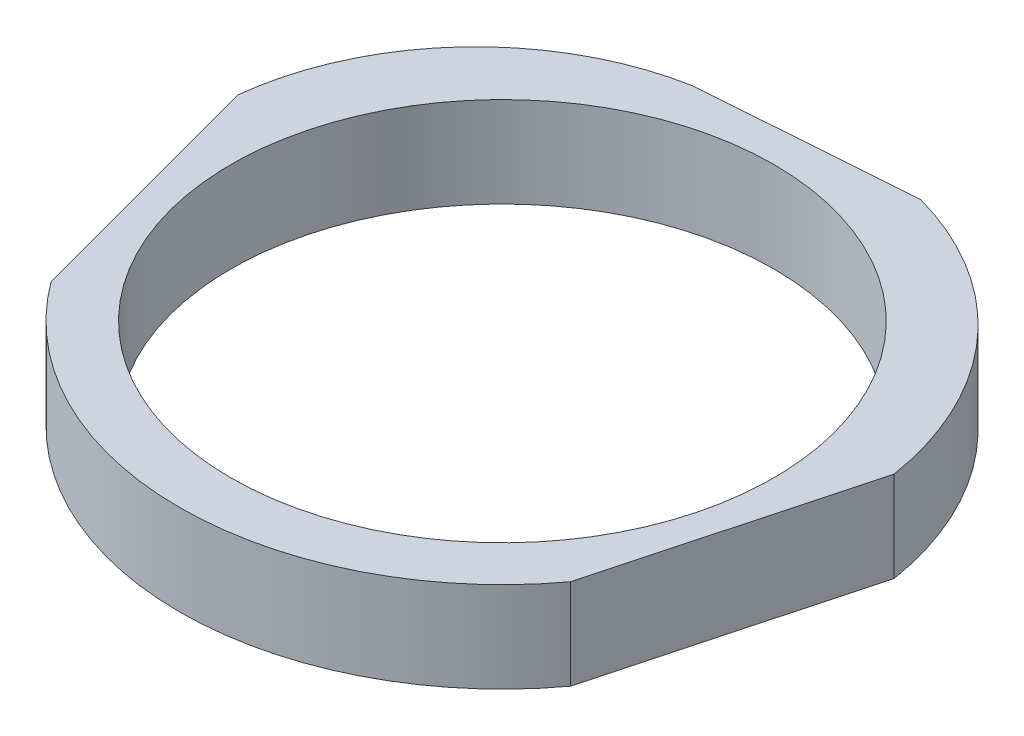
ISO-10303-21;
HEADER;
FILE_DESCRIPTION(('STEP AP214'),'2;1');
FILE_NAME('part.step','',(''),(''),'','','');
FILE_SCHEMA(('AUTOMOTIVE_DESIGN { 1 0 10303 214 1 1 1 1 }'));
ENDSEC;
DATA;
#1=APPLICATION_CONTEXT('core data for automotive mechanical design processes');
#2=APPLICATION_PROTOCOL_DEFINITION('international standard','automotive_design',2000,#1);
#3=PRODUCT_CONTEXT('',#1,'mechanical');
#4=PRODUCT('Part','Part','',(#3));
#5=PRODUCT_RELATED_PRODUCT_CATEGORY('part','',(#4));
#6=PRODUCT_DEFINITION_FORMATION('','',#4);
#7=PRODUCT_DEFINITION_CONTEXT('part definition',#1,'design');
#8=PRODUCT_DEFINITION('design','',#6,#7);
#9=PRODUCT_DEFINITION_SHAPE('','',#8);
#10=(LENGTH_UNIT() NAMED_UNIT(*) SI_UNIT(.MILLI.,.METRE.));
#11=(NAMED_UNIT(*) PLANE_ANGLE_UNIT() SI_UNIT($,.RADIAN.));
#12=(NAMED_UNIT(*) SI_UNIT($,.STERADIAN.) SOLID_ANGLE_UNIT());
#13=UNCERTAINTY_MEASURE_WITH_UNIT(LENGTH_MEASURE(1.E-05),#10,'distance_accuracy_value','');
#14=(GEOMETRIC_REPRESENTATION_CONTEXT(3) GLOBAL_UNCERTAINTY_ASSIGNED_CONTEXT((#13)) GLOBAL_UNIT_ASSIGNED_CONTEXT((#10,
#11,#12)) REPRESENTATION_CONTEXT('',''));
#15=CARTESIAN_POINT('',(0.,0.,0.));
#16=DIRECTION('',(0.,0.,1.));
#17=DIRECTION('',(1.,0.,0.));
#18=AXIS2_PLACEMENT_3D('',#15,#16,#17);
#19=CARTESIAN_POINT('',(0.,1.5,0.));
#20=DIRECTION('',(0.,-1.,0.));
#21=DIRECTION('',(0.,0.,-1.));
#22=AXIS2_PLACEMENT_3D('',#19,#20,#21);
#23=PLANE('',#22);
#24=CARTESIAN_POINT('',(0.,1.5,0.));
#25=DIRECTION('',(0.,1.,0.));
#26=DIRECTION('',(0.,0.,-1.));
#27=AXIS2_PLACEMENT_3D('',#24,#25,#26);
#28=CIRCLE('',#27,10.7009889381388);
#29=CARTESIAN_POINT('',(-8.61328417354084,1.5,6.35));
#30=VERTEX_POINT('',#29);
#31=CARTESIAN_POINT('',(8.61328417354084,1.5,6.35));
#32=VERTEX_POINT('',#31);
#33=EDGE_CURVE('E129',#30,#32,#28,.T.);
#34=ORIENTED_EDGE('',*,*,#33,.T.);
#35=DIRECTION('',(0.259311122223769,0.,-0.965793840263568));
#36=VECTOR('',#35,1.);
#37=CARTESIAN_POINT('',(8.61328417354084,1.5,6.35));
#38=LINE('',#37,#36);
#39=CARTESIAN_POINT('',(10.8834106281456,1.5,-2.10499463221916));
#40=VERTEX_POINT('',#39);
#41=EDGE_CURVE('E87',#32,#40,#38,.T.);
#42=ORIENTED_EDGE('',*,*,#41,.T.);
#43=CARTESIAN_POINT('',(0.71454837013126,1.5,-0.499901874327204));
#44=DIRECTION('',(0.,1.,0.));
#45=DIRECTION('',(0.,0.,-1.));
#46=AXIS2_PLACEMENT_3D('',#43,#44,#45);
#47=CIRCLE('',#46,10.2947599478524);
#48=CARTESIAN_POINT('',(3.44313637443088,1.5,-10.4264768066339));
#49=VERTEX_POINT('',#48);
#50=EDGE_CURVE('E100',#40,#49,#47,.T.);
#51=ORIENTED_EDGE('',*,*,#50,.T.);
#52=DIRECTION('',(-0.9973580207554,0.,0.0726428140621759));
#53=VECTOR('',#52,1.);
#54=CARTESIAN_POINT('',(-3.59094498208684,1.5,-9.91414777989908));
#55=LINE('',#54,#53);
#56=CARTESIAN_POINT('',(-3.59094498208684,1.5,-9.91414777989908));
#57=VERTEX_POINT('',#56);
#58=EDGE_CURVE('E94',#49,#57,#55,.T.);
#59=ORIENTED_EDGE('',*,*,#58,.T.);
#60=CARTESIAN_POINT('',(-2.00248523666896,1.5,-1.12122864174121));
#61=DIRECTION('',(0.,1.,0.));
#62=DIRECTION('',(0.,0.,-1.));
#63=AXIS2_PLACEMENT_3D('',#60,#61,#62);
#64=CIRCLE('',#63,8.93524657370998);
#65=CARTESIAN_POINT('',(-10.8834106281456,1.5,-2.10499463221916));
#66=VERTEX_POINT('',#65);
#67=EDGE_CURVE('E98',#57,#66,#64,.T.);
#68=ORIENTED_EDGE('',*,*,#67,.T.);
#69=DIRECTION('',(0.259311122223767,0.,0.965793840263568));
#70=VECTOR('',#69,1.);
#71=CARTESIAN_POINT('',(-8.61328417354084,1.5,6.35));
#72=LINE('',#71,#70);
#73=EDGE_CURVE('E50',#66,#30,#72,.T.);
#74=ORIENTED_EDGE('',*,*,#73,.T.);
#75=EDGE_LOOP('',(#34,#42,#51,#59,#68,#74));
#76=FACE_BOUND('',#75,.T.);
#77=CARTESIAN_POINT('',(0.,1.5,0.));
#78=DIRECTION('',(0.,1.,0.));
#79=DIRECTION('',(0.,0.,1.));
#80=AXIS2_PLACEMENT_3D('',#77,#78,#79);
#81=CIRCLE('',#80,9.);
#82=CARTESIAN_POINT('',(0.,1.5,9.));
#83=VERTEX_POINT('',#82);
#84=EDGE_CURVE('E122',#83,#83,#81,.T.);
#85=ORIENTED_EDGE('',*,*,#84,.F.);
#86=EDGE_LOOP('',(#85));
#87=FACE_BOUND('',#86,.T.);
#88=ADVANCED_FACE('F33',(#76,#87),#23,.F.);
#89=CARTESIAN_POINT('',(0.,-1.5,0.));
#90=DIRECTION('',(0.,-1.,0.));
#91=DIRECTION('',(0.,0.,-1.));
#92=AXIS2_PLACEMENT_3D('',#89,#90,#91);
#93=PLANE('',#92);
#94=CARTESIAN_POINT('',(0.,-1.5,0.));
#95=DIRECTION('',(0.,1.,0.));
#96=DIRECTION('',(0.,0.,-1.));
#97=AXIS2_PLACEMENT_3D('',#94,#95,#96);
#98=CIRCLE('',#97,10.7009889381388);
#99=CARTESIAN_POINT('',(-8.61328417354084,-1.5,6.35));
#100=VERTEX_POINT('',#99);
#101=CARTESIAN_POINT('',(8.61328417354084,-1.5,6.35));
#102=VERTEX_POINT('',#101);
#103=EDGE_CURVE('E118',#100,#102,#98,.T.);
#104=ORIENTED_EDGE('',*,*,#103,.F.);
#105=DIRECTION('',(0.259311122223767,0.,0.965793840263568));
#106=VECTOR('',#105,1.);
#107=CARTESIAN_POINT('',(-8.61328417354084,-1.5,6.35));
#108=LINE('',#107,#106);
#109=CARTESIAN_POINT('',(-10.8834106281456,-1.5,-2.10499463221916));
#110=VERTEX_POINT('',#109);
#111=EDGE_CURVE('E79',#110,#100,#108,.T.);
#112=ORIENTED_EDGE('',*,*,#111,.F.);
#113=CARTESIAN_POINT('',(-2.00248523666896,-1.5,-1.12122864174121));
#114=DIRECTION('',(0.,1.,0.));
#115=DIRECTION('',(0.,0.,-1.));
#116=AXIS2_PLACEMENT_3D('',#113,#114,#115);
#117=CIRCLE('',#116,8.93524657370998);
#118=CARTESIAN_POINT('',(-3.59094498208684,-1.5,-9.91414777989908));
#119=VERTEX_POINT('',#118);
#120=EDGE_CURVE('E73',#119,#110,#117,.T.);
#121=ORIENTED_EDGE('',*,*,#120,.F.);
#122=DIRECTION('',(-0.9973580207554,0.,0.0726428140621759));
#123=VECTOR('',#122,1.);
#124=CARTESIAN_POINT('',(-3.59094498208684,-1.5,-9.91414777989908));
#125=LINE('',#124,#123);
#126=CARTESIAN_POINT('',(3.44313637443088,-1.5,-10.4264768066339));
#127=VERTEX_POINT('',#126);
#128=EDGE_CURVE('E108',#127,#119,#125,.T.);
#129=ORIENTED_EDGE('',*,*,#128,.F.);
#130=CARTESIAN_POINT('',(0.71454837013126,-1.5,-0.499901874327204));
#131=DIRECTION('',(0.,1.,0.));
#132=DIRECTION('',(0.,0.,-1.));
#133=AXIS2_PLACEMENT_3D('',#130,#131,#132);
#134=CIRCLE('',#133,10.2947599478524);
#135=CARTESIAN_POINT('',(10.8834106281456,-1.5,-2.10499463221916));
#136=VERTEX_POINT('',#135);
#137=EDGE_CURVE('E124',#136,#127,#134,.T.);
#138=ORIENTED_EDGE('',*,*,#137,.F.);
#139=DIRECTION('',(0.259311122223769,0.,-0.965793840263568));
#140=VECTOR('',#139,1.);
#141=CARTESIAN_POINT('',(8.61328417354084,-1.5,6.35));
#142=LINE('',#141,#140);
#143=EDGE_CURVE('E121',#102,#136,#142,.T.);
#144=ORIENTED_EDGE('',*,*,#143,.F.);
#145=EDGE_LOOP('',(#104,#112,#121,#129,#138,#144));
#146=FACE_BOUND('',#145,.T.);
#147=CARTESIAN_POINT('',(0.,-1.5,0.));
#148=DIRECTION('',(0.,1.,0.));
#149=DIRECTION('',(0.,0.,1.));
#150=AXIS2_PLACEMENT_3D('',#147,#148,#149);
#151=CIRCLE('',#150,9.);
#152=CARTESIAN_POINT('',(0.,-1.5,9.));
#153=VERTEX_POINT('',#152);
#154=EDGE_CURVE('E222',#153,#153,#151,.T.);
#155=ORIENTED_EDGE('',*,*,#154,.T.);
#156=EDGE_LOOP('',(#155));
#157=FACE_BOUND('',#156,.T.);
#158=ADVANCED_FACE('F138',(#146,#157),#93,.T.);
#159=CARTESIAN_POINT('',(0.,1.5,0.));
#160=DIRECTION('',(0.,-1.,0.));
#161=DIRECTION('',(0.,0.,-1.));
#162=AXIS2_PLACEMENT_3D('',#159,#160,#161);
#163=CYLINDRICAL_SURFACE('',#162,10.7009889381388);
#164=ORIENTED_EDGE('',*,*,#103,.T.);
#165=DIRECTION('',(0.,-1.,0.));
#166=VECTOR('',#165,1.);
#167=CARTESIAN_POINT('',(8.61328417354084,1.5,6.35));
#168=LINE('',#167,#166);
#169=EDGE_CURVE('E11',#32,#102,#168,.T.);
#170=ORIENTED_EDGE('',*,*,#169,.F.);
#171=ORIENTED_EDGE('',*,*,#33,.F.);
#172=DIRECTION('',(0.,-1.,0.));
#173=VECTOR('',#172,1.);
#174=CARTESIAN_POINT('',(-8.61328417354084,1.5,6.35));
#175=LINE('',#174,#173);
#176=EDGE_CURVE('E114',#30,#100,#175,.T.);
#177=ORIENTED_EDGE('',*,*,#176,.T.);
#178=EDGE_LOOP('',(#164,#170,#171,#177));
#179=FACE_BOUND('',#178,.T.);
#180=ADVANCED_FACE('F35',(#179),#163,.T.);
#181=CARTESIAN_POINT('',(8.61328417354084,1.5,6.35));
#182=DIRECTION('',(-0.965793840263568,0.,-0.259311122223769));
#183=DIRECTION('',(-0.259311122223769,0.,0.965793840263568));
#184=AXIS2_PLACEMENT_3D('',#181,#182,#183);
#185=PLANE('',#184);
#186=ORIENTED_EDGE('',*,*,#143,.T.);
#187=DIRECTION('',(0.,-1.,0.));
#188=VECTOR('',#187,1.);
#189=CARTESIAN_POINT('',(10.8834106281456,1.5,-2.10499463221916));
#190=LINE('',#189,#188);
#191=EDGE_CURVE('E42',#40,#136,#190,.T.);
#192=ORIENTED_EDGE('',*,*,#191,.F.);
#193=ORIENTED_EDGE('',*,*,#41,.F.);
#194=ORIENTED_EDGE('',*,*,#169,.T.);
#195=EDGE_LOOP('',(#186,#192,#193,#194));
#196=FACE_BOUND('',#195,.T.);
#197=ADVANCED_FACE('F163',(#196),#185,.F.);
#198=CARTESIAN_POINT('',(0.71454837013126,1.5,-0.499901874327204));
#199=DIRECTION('',(0.,-1.,0.));
#200=DIRECTION('',(0.,0.,-1.));
#201=AXIS2_PLACEMENT_3D('',#198,#199,#200);
#202=CYLINDRICAL_SURFACE('',#201,10.2947599478524);
#203=ORIENTED_EDGE('',*,*,#137,.T.);
#204=DIRECTION('',(0.,-1.,0.));
#205=VECTOR('',#204,1.);
#206=CARTESIAN_POINT('',(3.44313637443088,1.5,-10.4264768066339));
#207=LINE('',#206,#205);
#208=EDGE_CURVE('E109',#49,#127,#207,.T.);
#209=ORIENTED_EDGE('',*,*,#208,.F.);
#210=ORIENTED_EDGE('',*,*,#50,.F.);
#211=ORIENTED_EDGE('',*,*,#191,.T.);
#212=EDGE_LOOP('',(#203,#209,#210,#211));
#213=FACE_BOUND('',#212,.T.);
#214=ADVANCED_FACE('F135',(#213),#202,.T.);
#215=CARTESIAN_POINT('',(-3.59094498208684,1.5,-9.91414777989908));
#216=DIRECTION('',(0.0726428140621759,0.,0.9973580207554));
#217=DIRECTION('',(0.9973580207554,0.,-0.0726428140621759));
#218=AXIS2_PLACEMENT_3D('',#215,#216,#217);
#219=PLANE('',#218);
#220=ORIENTED_EDGE('',*,*,#128,.T.);
#221=DIRECTION('',(0.,-1.,0.));
#222=VECTOR('',#221,1.);
#223=CARTESIAN_POINT('',(-3.59094498208684,1.5,-9.91414777989908));
#224=LINE('',#223,#222);
#225=EDGE_CURVE('E105',#57,#119,#224,.T.);
#226=ORIENTED_EDGE('',*,*,#225,.F.);
#227=ORIENTED_EDGE('',*,*,#58,.F.);
#228=ORIENTED_EDGE('',*,*,#208,.T.);
#229=EDGE_LOOP('',(#220,#226,#227,#228));
#230=FACE_BOUND('',#229,.T.);
#231=ADVANCED_FACE('F106',(#230),#219,.F.);
#232=CARTESIAN_POINT('',(-2.00248523666896,1.5,-1.12122864174121));
#233=DIRECTION('',(0.,-1.,0.));
#234=DIRECTION('',(0.,0.,-1.));
#235=AXIS2_PLACEMENT_3D('',#232,#233,#234);
#236=CYLINDRICAL_SURFACE('',#235,8.93524657370998);
#237=ORIENTED_EDGE('',*,*,#120,.T.);
#238=DIRECTION('',(0.,-1.,0.));
#239=VECTOR('',#238,1.);
#240=CARTESIAN_POINT('',(-10.8834106281456,1.5,-2.10499463221916));
#241=LINE('',#240,#239);
#242=EDGE_CURVE('E110',#66,#110,#241,.T.);
#243=ORIENTED_EDGE('',*,*,#242,.F.);
#244=ORIENTED_EDGE('',*,*,#67,.F.);
#245=ORIENTED_EDGE('',*,*,#225,.T.);
#246=EDGE_LOOP('',(#237,#243,#244,#245));
#247=FACE_BOUND('',#246,.T.);
#248=ADVANCED_FACE('F112',(#247),#236,.T.);
#249=CARTESIAN_POINT('',(-8.61328417354084,1.5,6.35));
#250=DIRECTION('',(0.965793840263568,0.,-0.259311122223767));
#251=DIRECTION('',(-0.259311122223767,0.,-0.965793840263568));
#252=AXIS2_PLACEMENT_3D('',#249,#250,#251);
#253=PLANE('',#252);
#254=ORIENTED_EDGE('',*,*,#111,.T.);
#255=ORIENTED_EDGE('',*,*,#176,.F.);
#256=ORIENTED_EDGE('',*,*,#73,.F.);
#257=ORIENTED_EDGE('',*,*,#242,.T.);
#258=EDGE_LOOP('',(#254,#255,#256,#257));
#259=FACE_BOUND('',#258,.T.);
#260=ADVANCED_FACE('F143',(#259),#253,.F.);
#261=CARTESIAN_POINT('',(0.,1.5,0.));
#262=DIRECTION('',(0.,-1.,0.));
#263=DIRECTION('',(0.,0.,-1.));
#264=AXIS2_PLACEMENT_3D('',#261,#262,#263);
#265=CYLINDRICAL_SURFACE('',#264,9.);
#266=ORIENTED_EDGE('',*,*,#84,.T.);
#267=EDGE_LOOP('',(#266));
#268=FACE_BOUND('',#267,.T.);
#269=ORIENTED_EDGE('',*,*,#154,.F.);
#270=EDGE_LOOP('',(#269));
#271=FACE_BOUND('',#270,.T.);
#272=ADVANCED_FACE('F145',(#268,#271),#265,.F.);
#273=CLOSED_SHELL('',(#88,#158,#180,#197,#214,#231,#248,#260,#272));
#274=MANIFOLD_SOLID_BREP('B2',#273);
#275=ADVANCED_BREP_SHAPE_REPRESENTATION('',(#18,#274),#14);
#276=SHAPE_DEFINITION_REPRESENTATION(#9,#275);
ENDSEC;
END-ISO-10303-21;
